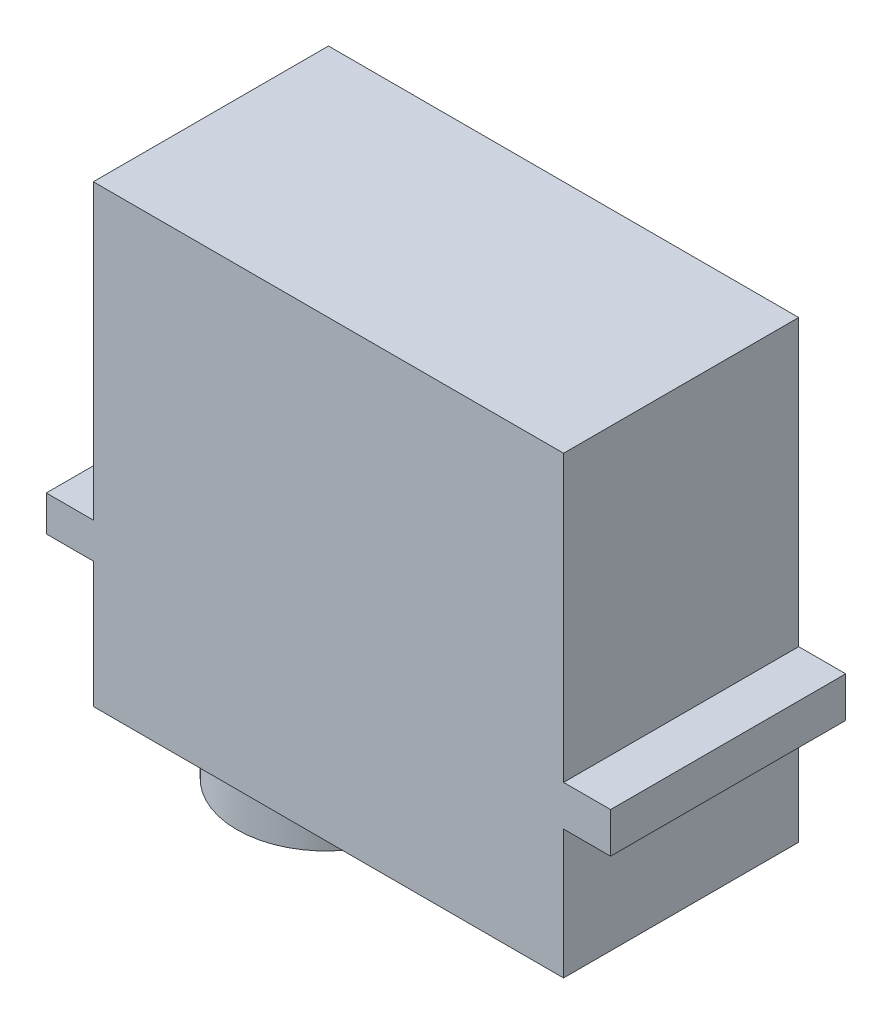
ISO-10303-21;
HEADER;
FILE_DESCRIPTION(('STEP AP214'),'2;1');
FILE_NAME('part.step','',(''),(''),'','','');
FILE_SCHEMA(('AUTOMOTIVE_DESIGN { 1 0 10303 214 1 1 1 1 }'));
ENDSEC;
DATA;
#1=APPLICATION_CONTEXT('core data for automotive mechanical design processes');
#2=APPLICATION_PROTOCOL_DEFINITION('international standard','automotive_design',2000,#1);
#3=PRODUCT_CONTEXT('',#1,'mechanical');
#4=PRODUCT('Part','Part','',(#3));
#5=PRODUCT_RELATED_PRODUCT_CATEGORY('part','',(#4));
#6=PRODUCT_DEFINITION_FORMATION('','',#4);
#7=PRODUCT_DEFINITION_CONTEXT('part definition',#1,'design');
#8=PRODUCT_DEFINITION('design','',#6,#7);
#9=PRODUCT_DEFINITION_SHAPE('','',#8);
#10=(LENGTH_UNIT() NAMED_UNIT(*) SI_UNIT(.MILLI.,.METRE.));
#11=(NAMED_UNIT(*) PLANE_ANGLE_UNIT() SI_UNIT($,.RADIAN.));
#12=(NAMED_UNIT(*) SI_UNIT($,.STERADIAN.) SOLID_ANGLE_UNIT());
#13=UNCERTAINTY_MEASURE_WITH_UNIT(LENGTH_MEASURE(1.E-05),#10,'distance_accuracy_value','');
#14=(GEOMETRIC_REPRESENTATION_CONTEXT(3) GLOBAL_UNCERTAINTY_ASSIGNED_CONTEXT((#13)) GLOBAL_UNIT_ASSIGNED_CONTEXT((#10,
#11,#12)) REPRESENTATION_CONTEXT('',''));
#15=CARTESIAN_POINT('',(0.,0.,0.));
#16=DIRECTION('',(0.,0.,1.));
#17=DIRECTION('',(1.,0.,0.));
#18=AXIS2_PLACEMENT_3D('',#15,#16,#17);
#19=CARTESIAN_POINT('',(40.,0.,20.));
#20=DIRECTION('',(-1.,0.,0.));
#21=DIRECTION('',(0.,0.,1.));
#22=AXIS2_PLACEMENT_3D('',#19,#20,#21);
#23=PLANE('',#22);
#24=DIRECTION('',(0.,0.,1.));
#25=VECTOR('',#24,1.);
#26=CARTESIAN_POINT('',(40.,14.4092412322071,20.));
#27=LINE('',#26,#25);
#28=CARTESIAN_POINT('',(40.,14.4092412322071,0.));
#29=VERTEX_POINT('',#28);
#30=CARTESIAN_POINT('',(40.,14.4092412322071,20.));
#31=VERTEX_POINT('',#30);
#32=EDGE_CURVE('E152',#29,#31,#27,.T.);
#33=ORIENTED_EDGE('',*,*,#32,.F.);
#34=DIRECTION('',(0.,1.,0.));
#35=VECTOR('',#34,1.);
#36=CARTESIAN_POINT('',(40.,0.,0.));
#37=LINE('',#36,#35);
#38=CARTESIAN_POINT('',(40.,38.6565376431533,0.));
#39=VERTEX_POINT('',#38);
#40=EDGE_CURVE('E210',#29,#39,#37,.T.);
#41=ORIENTED_EDGE('',*,*,#40,.T.);
#42=DIRECTION('',(0.,0.,-1.));
#43=VECTOR('',#42,1.);
#44=CARTESIAN_POINT('',(40.,38.6565376431533,20.));
#45=LINE('',#44,#43);
#46=CARTESIAN_POINT('',(40.,38.6565376431533,20.));
#47=VERTEX_POINT('',#46);
#48=EDGE_CURVE('E217',#47,#39,#45,.T.);
#49=ORIENTED_EDGE('',*,*,#48,.F.);
#50=DIRECTION('',(0.,1.,0.));
#51=VECTOR('',#50,1.);
#52=CARTESIAN_POINT('',(40.,0.,20.));
#53=LINE('',#52,#51);
#54=EDGE_CURVE('E58',#31,#47,#53,.T.);
#55=ORIENTED_EDGE('',*,*,#54,.F.);
#56=EDGE_LOOP('',(#33,#41,#49,#55));
#57=FACE_BOUND('',#56,.T.);
#58=ADVANCED_FACE('F43',(#57),#23,.F.);
#59=DIRECTION('',(0.,0.,-1.));
#60=VECTOR('',#59,1.);
#61=CARTESIAN_POINT('',(40.,10.9735631071378,20.));
#62=LINE('',#61,#60);
#63=CARTESIAN_POINT('',(40.,10.9735631071378,20.));
#64=VERTEX_POINT('',#63);
#65=CARTESIAN_POINT('',(40.,10.9735631071378,0.));
#66=VERTEX_POINT('',#65);
#67=EDGE_CURVE('E66',#64,#66,#62,.T.);
#68=ORIENTED_EDGE('',*,*,#67,.F.);
#69=CARTESIAN_POINT('',(40.,0.,20.));
#70=VERTEX_POINT('',#69);
#71=EDGE_CURVE('E156',#70,#64,#53,.T.);
#72=ORIENTED_EDGE('',*,*,#71,.F.);
#73=DIRECTION('',(0.,0.,-1.));
#74=VECTOR('',#73,1.);
#75=CARTESIAN_POINT('',(40.,0.,20.));
#76=LINE('',#75,#74);
#77=CARTESIAN_POINT('',(40.,0.,0.));
#78=VERTEX_POINT('',#77);
#79=EDGE_CURVE('E51',#70,#78,#76,.T.);
#80=ORIENTED_EDGE('',*,*,#79,.T.);
#81=EDGE_CURVE('E211',#78,#66,#37,.T.);
#82=ORIENTED_EDGE('',*,*,#81,.T.);
#83=EDGE_LOOP('',(#68,#72,#80,#82));
#84=FACE_BOUND('',#83,.T.);
#85=ADVANCED_FACE('F222',(#84),#23,.F.);
#86=CARTESIAN_POINT('',(0.,0.,20.));
#87=DIRECTION('',(1.,0.,0.));
#88=DIRECTION('',(0.,0.,-1.));
#89=AXIS2_PLACEMENT_3D('',#86,#87,#88);
#90=PLANE('',#89);
#91=DIRECTION('',(0.,0.,1.));
#92=VECTOR('',#91,1.);
#93=CARTESIAN_POINT('',(0.,10.7104264512646,0.));
#94=LINE('',#93,#92);
#95=CARTESIAN_POINT('',(0.,10.7104264512646,0.));
#96=VERTEX_POINT('',#95);
#97=CARTESIAN_POINT('',(0.,10.7104264512646,20.));
#98=VERTEX_POINT('',#97);
#99=EDGE_CURVE('E157',#96,#98,#94,.T.);
#100=ORIENTED_EDGE('',*,*,#99,.F.);
#101=DIRECTION('',(0.,-1.,0.));
#102=VECTOR('',#101,1.);
#103=CARTESIAN_POINT('',(0.,0.,0.));
#104=LINE('',#103,#102);
#105=CARTESIAN_POINT('',(0.,0.,0.));
#106=VERTEX_POINT('',#105);
#107=EDGE_CURVE('E194',#96,#106,#104,.T.);
#108=ORIENTED_EDGE('',*,*,#107,.T.);
#109=DIRECTION('',(0.,0.,-1.));
#110=VECTOR('',#109,1.);
#111=CARTESIAN_POINT('',(0.,0.,20.));
#112=LINE('',#111,#110);
#113=CARTESIAN_POINT('',(0.,0.,20.));
#114=VERTEX_POINT('',#113);
#115=EDGE_CURVE('E11',#114,#106,#112,.T.);
#116=ORIENTED_EDGE('',*,*,#115,.F.);
#117=DIRECTION('',(0.,-1.,0.));
#118=VECTOR('',#117,1.);
#119=CARTESIAN_POINT('',(0.,0.,20.));
#120=LINE('',#119,#118);
#121=EDGE_CURVE('E200',#98,#114,#120,.T.);
#122=ORIENTED_EDGE('',*,*,#121,.F.);
#123=EDGE_LOOP('',(#100,#108,#116,#122));
#124=FACE_BOUND('',#123,.T.);
#125=ADVANCED_FACE('F261',(#124),#90,.F.);
#126=CARTESIAN_POINT('',(0.,38.6565376431533,0.));
#127=VERTEX_POINT('',#126);
#128=CARTESIAN_POINT('',(0.,13.7307718116475,0.));
#129=VERTEX_POINT('',#128);
#130=EDGE_CURVE('E206',#127,#129,#104,.T.);
#131=ORIENTED_EDGE('',*,*,#130,.T.);
#132=DIRECTION('',(0.,0.,1.));
#133=VECTOR('',#132,1.);
#134=CARTESIAN_POINT('',(0.,13.7307718116475,0.));
#135=LINE('',#134,#133);
#136=CARTESIAN_POINT('',(0.,13.7307718116475,20.));
#137=VERTEX_POINT('',#136);
#138=EDGE_CURVE('E160',#129,#137,#135,.T.);
#139=ORIENTED_EDGE('',*,*,#138,.T.);
#140=CARTESIAN_POINT('',(0.,38.6565376431533,20.));
#141=VERTEX_POINT('',#140);
#142=EDGE_CURVE('E197',#141,#137,#120,.T.);
#143=ORIENTED_EDGE('',*,*,#142,.F.);
#144=DIRECTION('',(0.,0.,-1.));
#145=VECTOR('',#144,1.);
#146=CARTESIAN_POINT('',(0.,38.6565376431533,20.));
#147=LINE('',#146,#145);
#148=EDGE_CURVE('E205',#141,#127,#147,.T.);
#149=ORIENTED_EDGE('',*,*,#148,.T.);
#150=EDGE_LOOP('',(#131,#139,#143,#149));
#151=FACE_BOUND('',#150,.T.);
#152=ADVANCED_FACE('F45',(#151),#90,.F.);
#153=CARTESIAN_POINT('',(0.,0.,20.));
#154=DIRECTION('',(0.,1.,0.));
#155=DIRECTION('',(0.,0.,1.));
#156=AXIS2_PLACEMENT_3D('',#153,#154,#155);
#157=PLANE('',#156);
#158=CARTESIAN_POINT('',(9.18495698107547,0.,9.40071282240509));
#159=DIRECTION('',(0.,1.,0.));
#160=DIRECTION('',(0.,0.,1.));
#161=AXIS2_PLACEMENT_3D('',#158,#159,#160);
#162=CIRCLE('',#161,7.5716329329171);
#163=CARTESIAN_POINT('',(9.18495698107547,0.,16.9723457553222));
#164=VERTEX_POINT('',#163);
#165=EDGE_CURVE('E190',#164,#164,#162,.T.);
#166=ORIENTED_EDGE('',*,*,#165,.T.);
#167=EDGE_LOOP('',(#166));
#168=FACE_BOUND('',#167,.T.);
#169=DIRECTION('',(1.,0.,0.));
#170=VECTOR('',#169,1.);
#171=CARTESIAN_POINT('',(0.,0.,0.));
#172=LINE('',#171,#170);
#173=EDGE_CURVE('E208',#106,#78,#172,.T.);
#174=ORIENTED_EDGE('',*,*,#173,.T.);
#175=ORIENTED_EDGE('',*,*,#79,.F.);
#176=DIRECTION('',(1.,0.,0.));
#177=VECTOR('',#176,1.);
#178=CARTESIAN_POINT('',(0.,0.,20.));
#179=LINE('',#178,#177);
#180=EDGE_CURVE('E199',#114,#70,#179,.T.);
#181=ORIENTED_EDGE('',*,*,#180,.F.);
#182=ORIENTED_EDGE('',*,*,#115,.T.);
#183=EDGE_LOOP('',(#174,#175,#181,#182));
#184=FACE_BOUND('',#183,.T.);
#185=ADVANCED_FACE('F263',(#168,#184),#157,.F.);
#186=CARTESIAN_POINT('',(0.,38.6565376431533,20.));
#187=DIRECTION('',(0.,-1.,0.));
#188=DIRECTION('',(0.,0.,-1.));
#189=AXIS2_PLACEMENT_3D('',#186,#187,#188);
#190=PLANE('',#189);
#191=DIRECTION('',(-1.,0.,0.));
#192=VECTOR('',#191,1.);
#193=CARTESIAN_POINT('',(0.,38.6565376431533,0.));
#194=LINE('',#193,#192);
#195=EDGE_CURVE('E213',#39,#127,#194,.T.);
#196=ORIENTED_EDGE('',*,*,#195,.T.);
#197=ORIENTED_EDGE('',*,*,#148,.F.);
#198=DIRECTION('',(-1.,0.,0.));
#199=VECTOR('',#198,1.);
#200=CARTESIAN_POINT('',(0.,38.6565376431533,20.));
#201=LINE('',#200,#199);
#202=EDGE_CURVE('E203',#47,#141,#201,.T.);
#203=ORIENTED_EDGE('',*,*,#202,.F.);
#204=ORIENTED_EDGE('',*,*,#48,.T.);
#205=EDGE_LOOP('',(#196,#197,#203,#204));
#206=FACE_BOUND('',#205,.T.);
#207=ADVANCED_FACE('F245',(#206),#190,.F.);
#208=CARTESIAN_POINT('',(0.,0.,20.));
#209=DIRECTION('',(0.,0.,-1.));
#210=DIRECTION('',(-1.,0.,0.));
#211=AXIS2_PLACEMENT_3D('',#208,#209,#210);
#212=PLANE('',#211);
#213=ORIENTED_EDGE('',*,*,#142,.T.);
#214=DIRECTION('',(1.,0.,0.));
#215=VECTOR('',#214,1.);
#216=CARTESIAN_POINT('',(-4.00223402561994,13.7307718116475,20.));
#217=LINE('',#216,#215);
#218=CARTESIAN_POINT('',(-4.00223402561994,13.7307718116475,20.));
#219=VERTEX_POINT('',#218);
#220=EDGE_CURVE('E181',#219,#137,#217,.T.);
#221=ORIENTED_EDGE('',*,*,#220,.F.);
#222=DIRECTION('',(0.,-1.,0.));
#223=VECTOR('',#222,1.);
#224=CARTESIAN_POINT('',(-4.00223402561994,13.7307718116475,20.));
#225=LINE('',#224,#223);
#226=CARTESIAN_POINT('',(-4.00223402561994,10.7104264512646,20.));
#227=VERTEX_POINT('',#226);
#228=EDGE_CURVE('E171',#219,#227,#225,.T.);
#229=ORIENTED_EDGE('',*,*,#228,.T.);
#230=DIRECTION('',(1.,0.,0.));
#231=VECTOR('',#230,1.);
#232=CARTESIAN_POINT('',(-4.00223402561994,10.7104264512646,20.));
#233=LINE('',#232,#231);
#234=EDGE_CURVE('E184',#227,#98,#233,.T.);
#235=ORIENTED_EDGE('',*,*,#234,.T.);
#236=ORIENTED_EDGE('',*,*,#121,.T.);
#237=ORIENTED_EDGE('',*,*,#180,.T.);
#238=ORIENTED_EDGE('',*,*,#71,.T.);
#239=DIRECTION('',(-1.,0.,0.));
#240=VECTOR('',#239,1.);
#241=CARTESIAN_POINT('',(44.,10.9735631071378,20.));
#242=LINE('',#241,#240);
#243=CARTESIAN_POINT('',(44.,10.9735631071378,20.));
#244=VERTEX_POINT('',#243);
#245=EDGE_CURVE('E137',#244,#64,#242,.T.);
#246=ORIENTED_EDGE('',*,*,#245,.F.);
#247=DIRECTION('',(0.,-1.,0.));
#248=VECTOR('',#247,1.);
#249=CARTESIAN_POINT('',(44.,14.4092412322071,20.));
#250=LINE('',#249,#248);
#251=CARTESIAN_POINT('',(44.,14.4092412322071,20.));
#252=VERTEX_POINT('',#251);
#253=EDGE_CURVE('E143',#252,#244,#250,.T.);
#254=ORIENTED_EDGE('',*,*,#253,.F.);
#255=DIRECTION('',(-1.,0.,0.));
#256=VECTOR('',#255,1.);
#257=CARTESIAN_POINT('',(44.,14.4092412322071,20.));
#258=LINE('',#257,#256);
#259=EDGE_CURVE('E234',#252,#31,#258,.T.);
#260=ORIENTED_EDGE('',*,*,#259,.T.);
#261=ORIENTED_EDGE('',*,*,#54,.T.);
#262=ORIENTED_EDGE('',*,*,#202,.T.);
#263=EDGE_LOOP('',(#213,#221,#229,#235,#236,#237,#238,#246,#254,#260,#261,#262));
#264=FACE_BOUND('',#263,.T.);
#265=ADVANCED_FACE('F155',(#264),#212,.F.);
#266=CARTESIAN_POINT('',(0.,0.,0.));
#267=DIRECTION('',(0.,0.,-1.));
#268=DIRECTION('',(-1.,0.,0.));
#269=AXIS2_PLACEMENT_3D('',#266,#267,#268);
#270=PLANE('',#269);
#271=ORIENTED_EDGE('',*,*,#130,.F.);
#272=ORIENTED_EDGE('',*,*,#195,.F.);
#273=ORIENTED_EDGE('',*,*,#40,.F.);
#274=DIRECTION('',(-1.,0.,0.));
#275=VECTOR('',#274,1.);
#276=CARTESIAN_POINT('',(44.,14.4092412322071,0.));
#277=LINE('',#276,#275);
#278=CARTESIAN_POINT('',(44.,14.4092412322071,0.));
#279=VERTEX_POINT('',#278);
#280=EDGE_CURVE('E162',#279,#29,#277,.T.);
#281=ORIENTED_EDGE('',*,*,#280,.F.);
#282=DIRECTION('',(0.,1.,0.));
#283=VECTOR('',#282,1.);
#284=CARTESIAN_POINT('',(44.,14.4092412322071,0.));
#285=LINE('',#284,#283);
#286=CARTESIAN_POINT('',(44.,10.9735631071378,0.));
#287=VERTEX_POINT('',#286);
#288=EDGE_CURVE('E142',#287,#279,#285,.T.);
#289=ORIENTED_EDGE('',*,*,#288,.F.);
#290=DIRECTION('',(-1.,0.,0.));
#291=VECTOR('',#290,1.);
#292=CARTESIAN_POINT('',(44.,10.9735631071378,0.));
#293=LINE('',#292,#291);
#294=EDGE_CURVE('E139',#287,#66,#293,.T.);
#295=ORIENTED_EDGE('',*,*,#294,.T.);
#296=ORIENTED_EDGE('',*,*,#81,.F.);
#297=ORIENTED_EDGE('',*,*,#173,.F.);
#298=ORIENTED_EDGE('',*,*,#107,.F.);
#299=DIRECTION('',(1.,0.,0.));
#300=VECTOR('',#299,1.);
#301=CARTESIAN_POINT('',(-4.00223402561994,10.7104264512646,0.));
#302=LINE('',#301,#300);
#303=CARTESIAN_POINT('',(-4.00223402561994,10.7104264512646,0.));
#304=VERTEX_POINT('',#303);
#305=EDGE_CURVE('E187',#304,#96,#302,.T.);
#306=ORIENTED_EDGE('',*,*,#305,.F.);
#307=DIRECTION('',(0.,-1.,0.));
#308=VECTOR('',#307,1.);
#309=CARTESIAN_POINT('',(-4.00223402561994,13.7307718116475,0.));
#310=LINE('',#309,#308);
#311=CARTESIAN_POINT('',(-4.00223402561994,13.7307718116475,0.));
#312=VERTEX_POINT('',#311);
#313=EDGE_CURVE('E166',#312,#304,#310,.T.);
#314=ORIENTED_EDGE('',*,*,#313,.F.);
#315=DIRECTION('',(1.,0.,0.));
#316=VECTOR('',#315,1.);
#317=CARTESIAN_POINT('',(-4.00223402561994,13.7307718116475,0.));
#318=LINE('',#317,#316);
#319=EDGE_CURVE('E176',#312,#129,#318,.T.);
#320=ORIENTED_EDGE('',*,*,#319,.T.);
#321=EDGE_LOOP('',(#271,#272,#273,#281,#289,#295,#296,#297,#298,#306,#314,#320));
#322=FACE_BOUND('',#321,.T.);
#323=ADVANCED_FACE('F228',(#322),#270,.T.);
#324=CARTESIAN_POINT('',(9.18495698107547,-6.,9.40071282240509));
#325=DIRECTION('',(0.,1.,0.));
#326=DIRECTION('',(0.,0.,1.));
#327=AXIS2_PLACEMENT_3D('',#324,#325,#326);
#328=CYLINDRICAL_SURFACE('',#327,7.5716329329171);
#329=CARTESIAN_POINT('',(9.18495698107547,-6.,9.40071282240509));
#330=DIRECTION('',(0.,1.,0.));
#331=DIRECTION('',(0.,0.,1.));
#332=AXIS2_PLACEMENT_3D('',#329,#330,#331);
#333=CIRCLE('',#332,7.5716329329171);
#334=CARTESIAN_POINT('',(9.18495698107547,-6.,16.9723457553222));
#335=VERTEX_POINT('',#334);
#336=EDGE_CURVE('E191',#335,#335,#333,.T.);
#337=ORIENTED_EDGE('',*,*,#336,.T.);
#338=EDGE_LOOP('',(#337));
#339=FACE_BOUND('',#338,.T.);
#340=ORIENTED_EDGE('',*,*,#165,.F.);
#341=EDGE_LOOP('',(#340));
#342=FACE_BOUND('',#341,.T.);
#343=ADVANCED_FACE('F281',(#339,#342),#328,.T.);
#344=CARTESIAN_POINT('',(9.18495698107547,-6.,9.40071282240509));
#345=DIRECTION('',(0.,1.,0.));
#346=DIRECTION('',(0.,0.,1.));
#347=AXIS2_PLACEMENT_3D('',#344,#345,#346);
#348=PLANE('',#347);
#349=ORIENTED_EDGE('',*,*,#336,.F.);
#350=EDGE_LOOP('',(#349));
#351=FACE_BOUND('',#350,.T.);
#352=ADVANCED_FACE('F285',(#351),#348,.F.);
#353=CARTESIAN_POINT('',(-4.00223402561994,10.7104264512646,0.));
#354=DIRECTION('',(0.,1.,0.));
#355=DIRECTION('',(0.,0.,1.));
#356=AXIS2_PLACEMENT_3D('',#353,#354,#355);
#357=PLANE('',#356);
#358=ORIENTED_EDGE('',*,*,#99,.T.);
#359=ORIENTED_EDGE('',*,*,#234,.F.);
#360=DIRECTION('',(0.,0.,1.));
#361=VECTOR('',#360,1.);
#362=CARTESIAN_POINT('',(-4.00223402561994,10.7104264512646,0.));
#363=LINE('',#362,#361);
#364=EDGE_CURVE('E169',#304,#227,#363,.T.);
#365=ORIENTED_EDGE('',*,*,#364,.F.);
#366=ORIENTED_EDGE('',*,*,#305,.T.);
#367=EDGE_LOOP('',(#358,#359,#365,#366));
#368=FACE_BOUND('',#367,.T.);
#369=ADVANCED_FACE('F259',(#368),#357,.F.);
#370=CARTESIAN_POINT('',(-4.00223402561994,13.7307718116475,0.));
#371=DIRECTION('',(0.,1.,0.));
#372=DIRECTION('',(0.,0.,1.));
#373=AXIS2_PLACEMENT_3D('',#370,#371,#372);
#374=PLANE('',#373);
#375=ORIENTED_EDGE('',*,*,#138,.F.);
#376=ORIENTED_EDGE('',*,*,#319,.F.);
#377=DIRECTION('',(0.,0.,1.));
#378=VECTOR('',#377,1.);
#379=CARTESIAN_POINT('',(-4.00223402561994,13.7307718116475,0.));
#380=LINE('',#379,#378);
#381=EDGE_CURVE('E174',#312,#219,#380,.T.);
#382=ORIENTED_EDGE('',*,*,#381,.T.);
#383=ORIENTED_EDGE('',*,*,#220,.T.);
#384=EDGE_LOOP('',(#375,#376,#382,#383));
#385=FACE_BOUND('',#384,.T.);
#386=ADVANCED_FACE('F251',(#385),#374,.T.);
#387=CARTESIAN_POINT('',(-4.00223402561994,0.,0.));
#388=DIRECTION('',(-1.,0.,0.));
#389=DIRECTION('',(0.,0.,1.));
#390=AXIS2_PLACEMENT_3D('',#387,#388,#389);
#391=PLANE('',#390);
#392=ORIENTED_EDGE('',*,*,#313,.T.);
#393=ORIENTED_EDGE('',*,*,#364,.T.);
#394=ORIENTED_EDGE('',*,*,#228,.F.);
#395=ORIENTED_EDGE('',*,*,#381,.F.);
#396=EDGE_LOOP('',(#392,#393,#394,#395));
#397=FACE_BOUND('',#396,.T.);
#398=ADVANCED_FACE('F255',(#397),#391,.T.);
#399=CARTESIAN_POINT('',(44.,10.9735631071378,20.));
#400=DIRECTION('',(0.,1.,0.));
#401=DIRECTION('',(0.,0.,1.));
#402=AXIS2_PLACEMENT_3D('',#399,#400,#401);
#403=PLANE('',#402);
#404=ORIENTED_EDGE('',*,*,#67,.T.);
#405=ORIENTED_EDGE('',*,*,#294,.F.);
#406=DIRECTION('',(0.,0.,-1.));
#407=VECTOR('',#406,1.);
#408=CARTESIAN_POINT('',(44.,10.9735631071378,20.));
#409=LINE('',#408,#407);
#410=EDGE_CURVE('E133',#244,#287,#409,.T.);
#411=ORIENTED_EDGE('',*,*,#410,.F.);
#412=ORIENTED_EDGE('',*,*,#245,.T.);
#413=EDGE_LOOP('',(#404,#405,#411,#412));
#414=FACE_BOUND('',#413,.T.);
#415=ADVANCED_FACE('F135',(#414),#403,.F.);
#416=CARTESIAN_POINT('',(44.,14.4092412322071,20.));
#417=DIRECTION('',(0.,-1.,0.));
#418=DIRECTION('',(0.,0.,-1.));
#419=AXIS2_PLACEMENT_3D('',#416,#417,#418);
#420=PLANE('',#419);
#421=ORIENTED_EDGE('',*,*,#32,.T.);
#422=ORIENTED_EDGE('',*,*,#259,.F.);
#423=DIRECTION('',(0.,0.,1.));
#424=VECTOR('',#423,1.);
#425=CARTESIAN_POINT('',(44.,14.4092412322071,20.));
#426=LINE('',#425,#424);
#427=EDGE_CURVE('E148',#279,#252,#426,.T.);
#428=ORIENTED_EDGE('',*,*,#427,.F.);
#429=ORIENTED_EDGE('',*,*,#280,.T.);
#430=EDGE_LOOP('',(#421,#422,#428,#429));
#431=FACE_BOUND('',#430,.T.);
#432=ADVANCED_FACE('F240',(#431),#420,.F.);
#433=CARTESIAN_POINT('',(44.,0.,0.));
#434=DIRECTION('',(1.,0.,0.));
#435=DIRECTION('',(0.,0.,-1.));
#436=AXIS2_PLACEMENT_3D('',#433,#434,#435);
#437=PLANE('',#436);
#438=ORIENTED_EDGE('',*,*,#253,.T.);
#439=ORIENTED_EDGE('',*,*,#410,.T.);
#440=ORIENTED_EDGE('',*,*,#288,.T.);
#441=ORIENTED_EDGE('',*,*,#427,.T.);
#442=EDGE_LOOP('',(#438,#439,#440,#441));
#443=FACE_BOUND('',#442,.T.);
#444=ADVANCED_FACE('F146',(#443),#437,.T.);
#445=CLOSED_SHELL('',(#58,#85,#125,#152,#185,#207,#265,#323,#343,#352,#369,#386,#398,#415,#432,#444));
#446=MANIFOLD_SOLID_BREP('B2',#445);
#447=ADVANCED_BREP_SHAPE_REPRESENTATION('',(#18,#446),#14);
#448=SHAPE_DEFINITION_REPRESENTATION(#9,#447);
ENDSEC;
END-ISO-10303-21;
